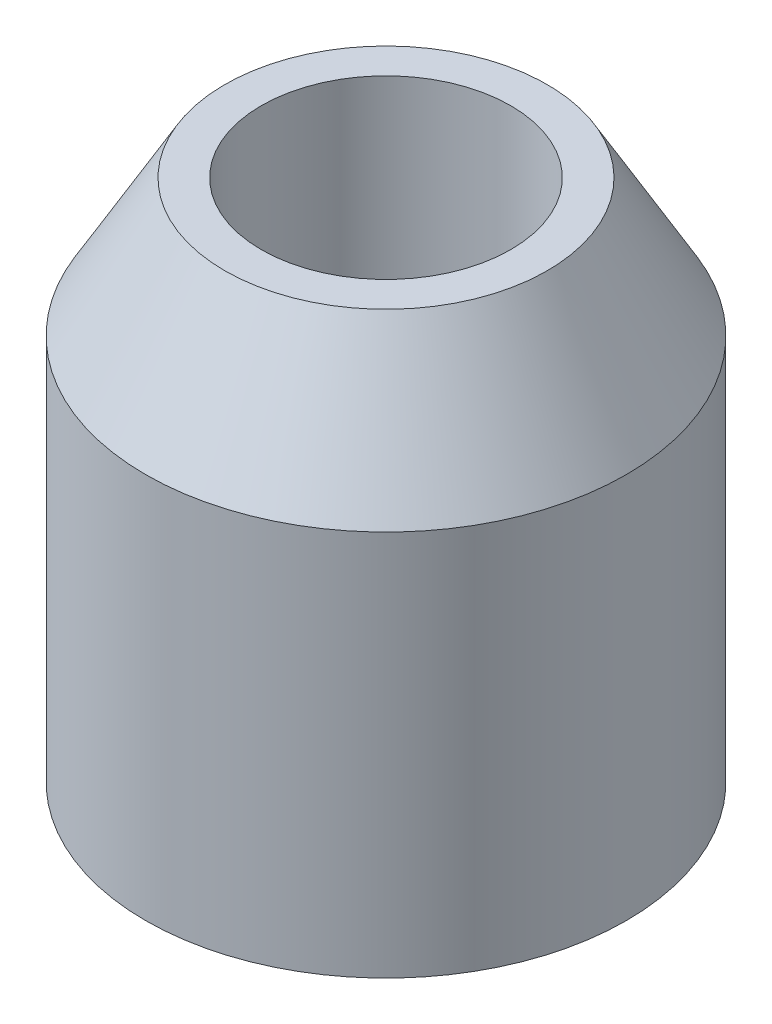
ISO-10303-21;
HEADER;
FILE_DESCRIPTION(('STEP AP214'),'2;1');
FILE_NAME('part.step','',(''),(''),'','','');
FILE_SCHEMA(('AUTOMOTIVE_DESIGN { 1 0 10303 214 1 1 1 1 }'));
ENDSEC;
DATA;
#1=APPLICATION_CONTEXT('core data for automotive mechanical design processes');
#2=APPLICATION_PROTOCOL_DEFINITION('international standard','automotive_design',2000,#1);
#3=PRODUCT_CONTEXT('',#1,'mechanical');
#4=PRODUCT('Part','Part','',(#3));
#5=PRODUCT_RELATED_PRODUCT_CATEGORY('part','',(#4));
#6=PRODUCT_DEFINITION_FORMATION('','',#4);
#7=PRODUCT_DEFINITION_CONTEXT('part definition',#1,'design');
#8=PRODUCT_DEFINITION('design','',#6,#7);
#9=PRODUCT_DEFINITION_SHAPE('','',#8);
#10=(LENGTH_UNIT() NAMED_UNIT(*) SI_UNIT(.MILLI.,.METRE.));
#11=(NAMED_UNIT(*) PLANE_ANGLE_UNIT() SI_UNIT($,.RADIAN.));
#12=(NAMED_UNIT(*) SI_UNIT($,.STERADIAN.) SOLID_ANGLE_UNIT());
#13=UNCERTAINTY_MEASURE_WITH_UNIT(LENGTH_MEASURE(1.E-05),#10,'distance_accuracy_value','');
#14=(GEOMETRIC_REPRESENTATION_CONTEXT(3) GLOBAL_UNCERTAINTY_ASSIGNED_CONTEXT((#13)) GLOBAL_UNIT_ASSIGNED_CONTEXT((#10,
#11,#12)) REPRESENTATION_CONTEXT('',''));
#15=CARTESIAN_POINT('',(0.,0.,0.));
#16=DIRECTION('',(0.,0.,1.));
#17=DIRECTION('',(1.,0.,0.));
#18=AXIS2_PLACEMENT_3D('',#15,#16,#17);
#19=CARTESIAN_POINT('',(0.,63.070411611676,0.));
#20=DIRECTION('',(0.,1.,0.));
#21=DIRECTION('',(0.,0.,1.));
#22=AXIS2_PLACEMENT_3D('',#19,#20,#21);
#23=CYLINDRICAL_SURFACE('',#22,10.25);
#24=CARTESIAN_POINT('',(0.,28.,0.));
#25=DIRECTION('',(0.,1.,0.));
#26=DIRECTION('',(0.,0.,1.));
#27=AXIS2_PLACEMENT_3D('',#24,#25,#26);
#28=CIRCLE('',#27,10.25);
#29=CARTESIAN_POINT('',(0.,28.,10.25));
#30=VERTEX_POINT('',#29);
#31=EDGE_CURVE('E56',#30,#30,#28,.T.);
#32=ORIENTED_EDGE('',*,*,#31,.F.);
#33=EDGE_LOOP('',(#32));
#34=FACE_BOUND('',#33,.T.);
#35=CARTESIAN_POINT('',(0.,43.,0.));
#36=DIRECTION('',(0.,1.,0.));
#37=DIRECTION('',(0.,0.,1.));
#38=AXIS2_PLACEMENT_3D('',#35,#36,#37);
#39=CIRCLE('',#38,10.25);
#40=CARTESIAN_POINT('',(0.,43.,10.25));
#41=VERTEX_POINT('',#40);
#42=EDGE_CURVE('E10',#41,#41,#39,.T.);
#43=ORIENTED_EDGE('',*,*,#42,.T.);
#44=EDGE_LOOP('',(#43));
#45=FACE_BOUND('',#44,.T.);
#46=ADVANCED_FACE('F31',(#34,#45),#23,.F.);
#47=CARTESIAN_POINT('',(10.25,43.,0.));
#48=DIRECTION('',(0.,-1.,0.));
#49=DIRECTION('',(0.,0.,-1.));
#50=AXIS2_PLACEMENT_3D('',#47,#48,#49);
#51=PLANE('',#50);
#52=ORIENTED_EDGE('',*,*,#42,.F.);
#53=EDGE_LOOP('',(#52));
#54=FACE_BOUND('',#53,.T.);
#55=CARTESIAN_POINT('',(0.,43.,0.));
#56=DIRECTION('',(0.,1.,0.));
#57=DIRECTION('',(0.,0.,1.));
#58=AXIS2_PLACEMENT_3D('',#55,#56,#57);
#59=CIRCLE('',#58,13.25);
#60=CARTESIAN_POINT('',(0.,43.,13.25));
#61=VERTEX_POINT('',#60);
#62=EDGE_CURVE('E37',#61,#61,#59,.T.);
#63=ORIENTED_EDGE('',*,*,#62,.T.);
#64=EDGE_LOOP('',(#63));
#65=FACE_BOUND('',#64,.T.);
#66=ADVANCED_FACE('F63',(#54,#65),#51,.F.);
#67=CARTESIAN_POINT('',(0.,31.7416697508022,0.));
#68=DIRECTION('',(0.,-1.,0.));
#69=DIRECTION('',(0.,0.,-1.));
#70=AXIS2_PLACEMENT_3D('',#67,#68,#69);
#71=CONICAL_SURFACE('',#70,19.75,0.523598775598297);
#72=ORIENTED_EDGE('',*,*,#62,.F.);
#73=EDGE_LOOP('',(#72));
#74=FACE_BOUND('',#73,.T.);
#75=CARTESIAN_POINT('',(0.,31.7416697508022,0.));
#76=DIRECTION('',(0.,1.,0.));
#77=DIRECTION('',(0.,0.,1.));
#78=AXIS2_PLACEMENT_3D('',#75,#76,#77);
#79=CIRCLE('',#78,19.75);
#80=CARTESIAN_POINT('',(0.,31.7416697508022,19.75));
#81=VERTEX_POINT('',#80);
#82=EDGE_CURVE('E41',#81,#81,#79,.T.);
#83=ORIENTED_EDGE('',*,*,#82,.T.);
#84=EDGE_LOOP('',(#83));
#85=FACE_BOUND('',#84,.T.);
#86=ADVANCED_FACE('F67',(#74,#85),#71,.T.);
#87=CARTESIAN_POINT('',(0.,63.070411611676,0.));
#88=DIRECTION('',(0.,1.,0.));
#89=DIRECTION('',(0.,0.,1.));
#90=AXIS2_PLACEMENT_3D('',#87,#88,#89);
#91=CYLINDRICAL_SURFACE('',#90,19.75);
#92=ORIENTED_EDGE('',*,*,#82,.F.);
#93=EDGE_LOOP('',(#92));
#94=FACE_BOUND('',#93,.T.);
#95=CARTESIAN_POINT('',(0.,0.,0.));
#96=DIRECTION('',(0.,1.,0.));
#97=DIRECTION('',(0.,0.,1.));
#98=AXIS2_PLACEMENT_3D('',#95,#96,#97);
#99=CIRCLE('',#98,19.75);
#100=CARTESIAN_POINT('',(0.,0.,19.75));
#101=VERTEX_POINT('',#100);
#102=EDGE_CURVE('E45',#101,#101,#99,.T.);
#103=ORIENTED_EDGE('',*,*,#102,.T.);
#104=EDGE_LOOP('',(#103));
#105=FACE_BOUND('',#104,.T.);
#106=ADVANCED_FACE('F72',(#94,#105),#91,.T.);
#107=CARTESIAN_POINT('',(19.75,0.,0.));
#108=DIRECTION('',(0.,1.,0.));
#109=DIRECTION('',(0.,0.,1.));
#110=AXIS2_PLACEMENT_3D('',#107,#108,#109);
#111=PLANE('',#110);
#112=ORIENTED_EDGE('',*,*,#102,.F.);
#113=EDGE_LOOP('',(#112));
#114=FACE_BOUND('',#113,.T.);
#115=CARTESIAN_POINT('',(0.,0.,0.));
#116=DIRECTION('',(0.,1.,0.));
#117=DIRECTION('',(0.,0.,1.));
#118=AXIS2_PLACEMENT_3D('',#115,#116,#117);
#119=CIRCLE('',#118,16.75);
#120=CARTESIAN_POINT('',(0.,0.,16.75));
#121=VERTEX_POINT('',#120);
#122=EDGE_CURVE('E50',#121,#121,#119,.T.);
#123=ORIENTED_EDGE('',*,*,#122,.T.);
#124=EDGE_LOOP('',(#123));
#125=FACE_BOUND('',#124,.T.);
#126=ADVANCED_FACE('F78',(#114,#125),#111,.F.);
#127=CARTESIAN_POINT('',(0.,63.070411611676,0.));
#128=DIRECTION('',(0.,1.,0.));
#129=DIRECTION('',(0.,0.,1.));
#130=AXIS2_PLACEMENT_3D('',#127,#128,#129);
#131=CYLINDRICAL_SURFACE('',#130,16.75);
#132=ORIENTED_EDGE('',*,*,#122,.F.);
#133=EDGE_LOOP('',(#132));
#134=FACE_BOUND('',#133,.T.);
#135=CARTESIAN_POINT('',(0.,28.,0.));
#136=DIRECTION('',(0.,1.,0.));
#137=DIRECTION('',(0.,0.,1.));
#138=AXIS2_PLACEMENT_3D('',#135,#136,#137);
#139=CIRCLE('',#138,16.75);
#140=CARTESIAN_POINT('',(0.,28.,16.75));
#141=VERTEX_POINT('',#140);
#142=EDGE_CURVE('E53',#141,#141,#139,.T.);
#143=ORIENTED_EDGE('',*,*,#142,.T.);
#144=EDGE_LOOP('',(#143));
#145=FACE_BOUND('',#144,.T.);
#146=ADVANCED_FACE('F82',(#134,#145),#131,.F.);
#147=CARTESIAN_POINT('',(16.75,28.,0.));
#148=DIRECTION('',(0.,1.,0.));
#149=DIRECTION('',(0.,0.,1.));
#150=AXIS2_PLACEMENT_3D('',#147,#148,#149);
#151=PLANE('',#150);
#152=ORIENTED_EDGE('',*,*,#142,.F.);
#153=EDGE_LOOP('',(#152));
#154=FACE_BOUND('',#153,.T.);
#155=ORIENTED_EDGE('',*,*,#31,.T.);
#156=EDGE_LOOP('',(#155));
#157=FACE_BOUND('',#156,.T.);
#158=ADVANCED_FACE('F60',(#154,#157),#151,.F.);
#159=CLOSED_SHELL('',(#46,#66,#86,#106,#126,#146,#158));
#160=MANIFOLD_SOLID_BREP('B2',#159);
#161=ADVANCED_BREP_SHAPE_REPRESENTATION('',(#18,#160),#14);
#162=SHAPE_DEFINITION_REPRESENTATION(#9,#161);
ENDSEC;
END-ISO-10303-21;
